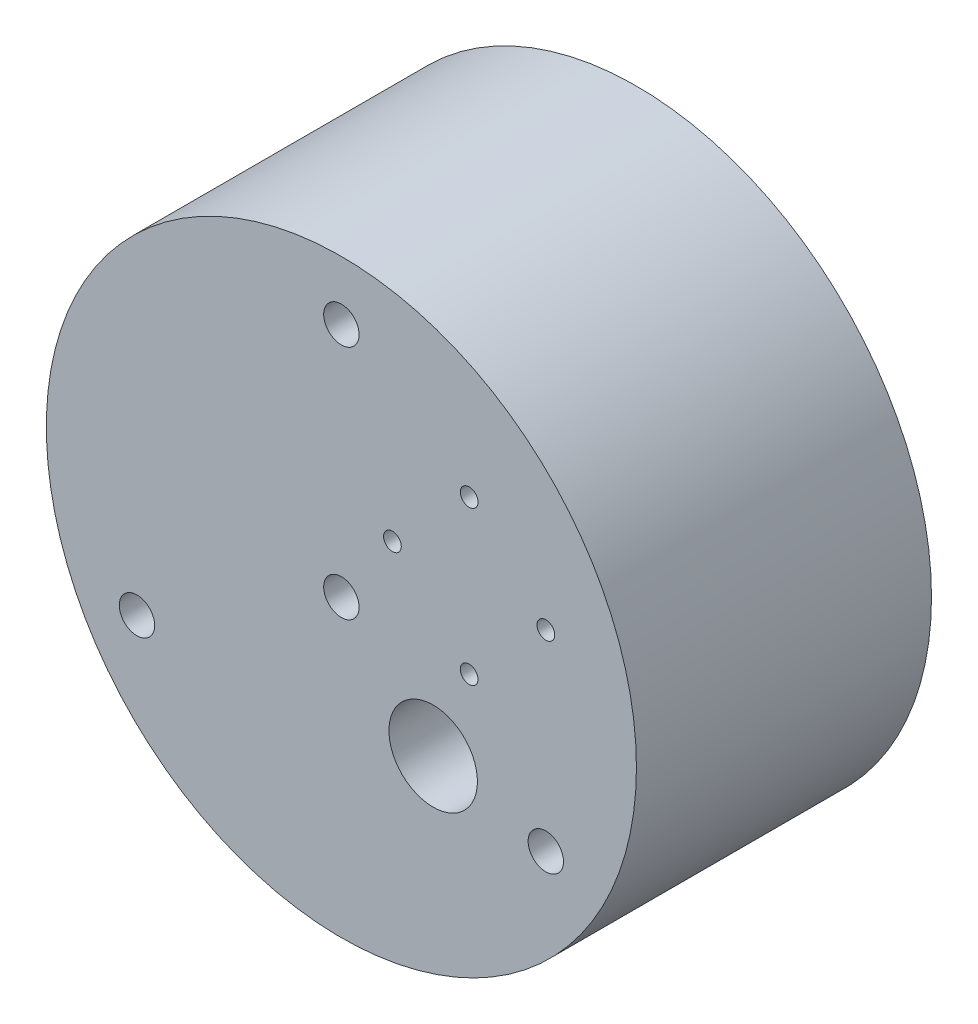
ISO-10303-21;
HEADER;
FILE_DESCRIPTION(('STEP AP214'),'2;1');
FILE_NAME('part.step','',(''),(''),'','','');
FILE_SCHEMA(('AUTOMOTIVE_DESIGN { 1 0 10303 214 1 1 1 1 }'));
ENDSEC;
DATA;
#1=APPLICATION_CONTEXT('core data for automotive mechanical design processes');
#2=APPLICATION_PROTOCOL_DEFINITION('international standard','automotive_design',2000,#1);
#3=PRODUCT_CONTEXT('',#1,'mechanical');
#4=PRODUCT('Part','Part','',(#3));
#5=PRODUCT_RELATED_PRODUCT_CATEGORY('part','',(#4));
#6=PRODUCT_DEFINITION_FORMATION('','',#4);
#7=PRODUCT_DEFINITION_CONTEXT('part definition',#1,'design');
#8=PRODUCT_DEFINITION('design','',#6,#7);
#9=PRODUCT_DEFINITION_SHAPE('','',#8);
#10=(LENGTH_UNIT() NAMED_UNIT(*) SI_UNIT(.MILLI.,.METRE.));
#11=(NAMED_UNIT(*) PLANE_ANGLE_UNIT() SI_UNIT($,.RADIAN.));
#12=(NAMED_UNIT(*) SI_UNIT($,.STERADIAN.) SOLID_ANGLE_UNIT());
#13=UNCERTAINTY_MEASURE_WITH_UNIT(LENGTH_MEASURE(1.E-05),#10,'distance_accuracy_value','');
#14=(GEOMETRIC_REPRESENTATION_CONTEXT(3) GLOBAL_UNCERTAINTY_ASSIGNED_CONTEXT((#13)) GLOBAL_UNIT_ASSIGNED_CONTEXT((#10,
#11,#12)) REPRESENTATION_CONTEXT('',''));
#15=CARTESIAN_POINT('',(0.,0.,0.));
#16=DIRECTION('',(0.,0.,1.));
#17=DIRECTION('',(1.,0.,0.));
#18=AXIS2_PLACEMENT_3D('',#15,#16,#17);
#19=CARTESIAN_POINT('',(0.,0.,50.));
#20=DIRECTION('',(0.,0.,-1.));
#21=DIRECTION('',(-1.,0.,0.));
#22=AXIS2_PLACEMENT_3D('',#19,#20,#21);
#23=CYLINDRICAL_SURFACE('',#22,50.);
#24=CARTESIAN_POINT('',(0.,0.,50.));
#25=DIRECTION('',(0.,0.,1.));
#26=DIRECTION('',(1.,0.,0.));
#27=AXIS2_PLACEMENT_3D('',#24,#25,#26);
#28=CIRCLE('',#27,50.);
#29=CARTESIAN_POINT('',(50.,0.,50.));
#30=VERTEX_POINT('',#29);
#31=EDGE_CURVE('E10',#30,#30,#28,.T.);
#32=ORIENTED_EDGE('',*,*,#31,.F.);
#33=EDGE_LOOP('',(#32));
#34=FACE_BOUND('',#33,.T.);
#35=CARTESIAN_POINT('',(0.,0.,0.));
#36=DIRECTION('',(0.,0.,1.));
#37=DIRECTION('',(1.,0.,0.));
#38=AXIS2_PLACEMENT_3D('',#35,#36,#37);
#39=CIRCLE('',#38,50.);
#40=CARTESIAN_POINT('',(50.,0.,0.));
#41=VERTEX_POINT('',#40);
#42=EDGE_CURVE('E44',#41,#41,#39,.T.);
#43=ORIENTED_EDGE('',*,*,#42,.T.);
#44=EDGE_LOOP('',(#43));
#45=FACE_BOUND('',#44,.T.);
#46=ADVANCED_FACE('F41',(#34,#45),#23,.T.);
#47=CARTESIAN_POINT('',(0.,0.,50.));
#48=DIRECTION('',(0.,0.,1.));
#49=DIRECTION('',(1.,0.,0.));
#50=AXIS2_PLACEMENT_3D('',#47,#48,#49);
#51=PLANE('',#50);
#52=CARTESIAN_POINT('',(15.5563491861041,-15.556349186104,50.));
#53=DIRECTION('',(0.,0.,1.));
#54=DIRECTION('',(1.,0.,0.));
#55=AXIS2_PLACEMENT_3D('',#52,#53,#54);
#56=CIRCLE('',#55,7.5);
#57=CARTESIAN_POINT('',(23.0563491861041,-15.556349186104,50.));
#58=VERTEX_POINT('',#57);
#59=EDGE_CURVE('E119',#58,#58,#56,.T.);
#60=ORIENTED_EDGE('',*,*,#59,.F.);
#61=EDGE_LOOP('',(#60));
#62=FACE_BOUND('',#61,.T.);
#63=CARTESIAN_POINT('',(21.6506350946112,25.4999999999999,50.));
#64=DIRECTION('',(0.,0.,1.));
#65=DIRECTION('',(1.,0.,0.));
#66=AXIS2_PLACEMENT_3D('',#63,#64,#65);
#67=CIRCLE('',#66,1.5);
#68=CARTESIAN_POINT('',(23.1506350946112,25.4999999999999,50.));
#69=VERTEX_POINT('',#68);
#70=EDGE_CURVE('E112',#69,#69,#67,.T.);
#71=ORIENTED_EDGE('',*,*,#70,.F.);
#72=EDGE_LOOP('',(#71));
#73=FACE_BOUND('',#72,.T.);
#74=CARTESIAN_POINT('',(34.6506350946112,12.4999999999999,50.));
#75=DIRECTION('',(0.,0.,1.));
#76=DIRECTION('',(1.,0.,0.));
#77=AXIS2_PLACEMENT_3D('',#74,#75,#76);
#78=CIRCLE('',#77,1.5);
#79=CARTESIAN_POINT('',(36.1506350946112,12.4999999999999,50.));
#80=VERTEX_POINT('',#79);
#81=EDGE_CURVE('E108',#80,#80,#78,.T.);
#82=ORIENTED_EDGE('',*,*,#81,.F.);
#83=EDGE_LOOP('',(#82));
#84=FACE_BOUND('',#83,.T.);
#85=CARTESIAN_POINT('',(21.6506350946112,-0.500000000000111,50.));
#86=DIRECTION('',(0.,0.,1.));
#87=DIRECTION('',(1.,0.,0.));
#88=AXIS2_PLACEMENT_3D('',#85,#86,#87);
#89=CIRCLE('',#88,1.5);
#90=CARTESIAN_POINT('',(23.1506350946112,-0.500000000000111,50.));
#91=VERTEX_POINT('',#90);
#92=EDGE_CURVE('E100',#91,#91,#89,.T.);
#93=ORIENTED_EDGE('',*,*,#92,.F.);
#94=EDGE_LOOP('',(#93));
#95=FACE_BOUND('',#94,.T.);
#96=CARTESIAN_POINT('',(8.65063509461123,12.5,50.));
#97=DIRECTION('',(0.,0.,1.));
#98=DIRECTION('',(1.,0.,0.));
#99=AXIS2_PLACEMENT_3D('',#96,#97,#98);
#100=CIRCLE('',#99,1.5);
#101=CARTESIAN_POINT('',(10.1506350946112,12.5,50.));
#102=VERTEX_POINT('',#101);
#103=EDGE_CURVE('E91',#102,#102,#100,.T.);
#104=ORIENTED_EDGE('',*,*,#103,.F.);
#105=EDGE_LOOP('',(#104));
#106=FACE_BOUND('',#105,.T.);
#107=CARTESIAN_POINT('',(0.,40.,50.));
#108=DIRECTION('',(0.,0.,1.));
#109=DIRECTION('',(1.,0.,0.));
#110=AXIS2_PLACEMENT_3D('',#107,#108,#109);
#111=CIRCLE('',#110,3.);
#112=CARTESIAN_POINT('',(3.,40.,50.));
#113=VERTEX_POINT('',#112);
#114=EDGE_CURVE('E80',#113,#113,#111,.T.);
#115=ORIENTED_EDGE('',*,*,#114,.F.);
#116=EDGE_LOOP('',(#115));
#117=FACE_BOUND('',#116,.T.);
#118=CARTESIAN_POINT('',(0.,0.,50.));
#119=DIRECTION('',(0.,0.,1.));
#120=DIRECTION('',(1.,0.,0.));
#121=AXIS2_PLACEMENT_3D('',#118,#119,#120);
#122=CIRCLE('',#121,3.);
#123=CARTESIAN_POINT('',(3.,0.,50.));
#124=VERTEX_POINT('',#123);
#125=EDGE_CURVE('E76',#124,#124,#122,.T.);
#126=ORIENTED_EDGE('',*,*,#125,.F.);
#127=EDGE_LOOP('',(#126));
#128=FACE_BOUND('',#127,.T.);
#129=CARTESIAN_POINT('',(34.6410161513775,-20.,50.));
#130=DIRECTION('',(0.,0.,1.));
#131=DIRECTION('',(1.,0.,0.));
#132=AXIS2_PLACEMENT_3D('',#129,#130,#131);
#133=CIRCLE('',#132,3.0000000000002);
#134=CARTESIAN_POINT('',(37.6410161513777,-20.,50.));
#135=VERTEX_POINT('',#134);
#136=EDGE_CURVE('E68',#135,#135,#133,.T.);
#137=ORIENTED_EDGE('',*,*,#136,.F.);
#138=EDGE_LOOP('',(#137));
#139=FACE_BOUND('',#138,.T.);
#140=CARTESIAN_POINT('',(-34.6410161513775,-20.,50.));
#141=DIRECTION('',(0.,0.,1.));
#142=DIRECTION('',(1.,0.,0.));
#143=AXIS2_PLACEMENT_3D('',#140,#141,#142);
#144=CIRCLE('',#143,3.);
#145=CARTESIAN_POINT('',(-31.6410161513775,-20.,50.));
#146=VERTEX_POINT('',#145);
#147=EDGE_CURVE('E59',#146,#146,#144,.T.);
#148=ORIENTED_EDGE('',*,*,#147,.F.);
#149=EDGE_LOOP('',(#148));
#150=FACE_BOUND('',#149,.T.);
#151=ORIENTED_EDGE('',*,*,#31,.T.);
#152=EDGE_LOOP('',(#151));
#153=FACE_BOUND('',#152,.T.);
#154=ADVANCED_FACE('F137',(#62,#73,#84,#95,#106,#117,#128,#139,#150,#153),#51,.T.);
#155=CARTESIAN_POINT('',(0.,0.,0.));
#156=DIRECTION('',(0.,0.,1.));
#157=DIRECTION('',(1.,0.,0.));
#158=AXIS2_PLACEMENT_3D('',#155,#156,#157);
#159=PLANE('',#158);
#160=CARTESIAN_POINT('',(15.5563491861041,-15.556349186104,0.));
#161=DIRECTION('',(0.,0.,1.));
#162=DIRECTION('',(1.,0.,0.));
#163=AXIS2_PLACEMENT_3D('',#160,#161,#162);
#164=CIRCLE('',#163,7.5);
#165=CARTESIAN_POINT('',(23.0563491861041,-15.556349186104,0.));
#166=VERTEX_POINT('',#165);
#167=EDGE_CURVE('E92',#166,#166,#164,.T.);
#168=ORIENTED_EDGE('',*,*,#167,.T.);
#169=EDGE_LOOP('',(#168));
#170=FACE_BOUND('',#169,.T.);
#171=CARTESIAN_POINT('',(0.,40.,0.));
#172=DIRECTION('',(0.,0.,1.));
#173=DIRECTION('',(1.,0.,0.));
#174=AXIS2_PLACEMENT_3D('',#171,#172,#173);
#175=CIRCLE('',#174,3.);
#176=CARTESIAN_POINT('',(3.,40.,0.));
#177=VERTEX_POINT('',#176);
#178=EDGE_CURVE('E53',#177,#177,#175,.T.);
#179=ORIENTED_EDGE('',*,*,#178,.T.);
#180=EDGE_LOOP('',(#179));
#181=FACE_BOUND('',#180,.T.);
#182=CARTESIAN_POINT('',(0.,0.,0.));
#183=DIRECTION('',(0.,0.,1.));
#184=DIRECTION('',(1.,0.,0.));
#185=AXIS2_PLACEMENT_3D('',#182,#183,#184);
#186=CIRCLE('',#185,3.);
#187=CARTESIAN_POINT('',(3.,0.,0.));
#188=VERTEX_POINT('',#187);
#189=EDGE_CURVE('E72',#188,#188,#186,.T.);
#190=ORIENTED_EDGE('',*,*,#189,.T.);
#191=EDGE_LOOP('',(#190));
#192=FACE_BOUND('',#191,.T.);
#193=CARTESIAN_POINT('',(34.6410161513775,-20.,0.));
#194=DIRECTION('',(0.,0.,1.));
#195=DIRECTION('',(1.,0.,0.));
#196=AXIS2_PLACEMENT_3D('',#193,#194,#195);
#197=CIRCLE('',#196,3.0000000000002);
#198=CARTESIAN_POINT('',(37.6410161513777,-20.,0.));
#199=VERTEX_POINT('',#198);
#200=EDGE_CURVE('E64',#199,#199,#197,.T.);
#201=ORIENTED_EDGE('',*,*,#200,.T.);
#202=EDGE_LOOP('',(#201));
#203=FACE_BOUND('',#202,.T.);
#204=CARTESIAN_POINT('',(-34.6410161513775,-20.,0.));
#205=DIRECTION('',(0.,0.,1.));
#206=DIRECTION('',(1.,0.,0.));
#207=AXIS2_PLACEMENT_3D('',#204,#205,#206);
#208=CIRCLE('',#207,3.);
#209=CARTESIAN_POINT('',(-31.6410161513775,-20.,0.));
#210=VERTEX_POINT('',#209);
#211=EDGE_CURVE('E55',#210,#210,#208,.T.);
#212=ORIENTED_EDGE('',*,*,#211,.T.);
#213=EDGE_LOOP('',(#212));
#214=FACE_BOUND('',#213,.T.);
#215=ORIENTED_EDGE('',*,*,#42,.F.);
#216=EDGE_LOOP('',(#215));
#217=FACE_BOUND('',#216,.T.);
#218=ADVANCED_FACE('F127',(#170,#181,#192,#203,#214,#217),#159,.F.);
#219=CARTESIAN_POINT('',(-34.6410161513775,-20.,0.));
#220=DIRECTION('',(0.,0.,1.));
#221=DIRECTION('',(1.,0.,0.));
#222=AXIS2_PLACEMENT_3D('',#219,#220,#221);
#223=CYLINDRICAL_SURFACE('',#222,3.);
#224=ORIENTED_EDGE('',*,*,#211,.F.);
#225=EDGE_LOOP('',(#224));
#226=FACE_BOUND('',#225,.T.);
#227=ORIENTED_EDGE('',*,*,#147,.T.);
#228=EDGE_LOOP('',(#227));
#229=FACE_BOUND('',#228,.T.);
#230=ADVANCED_FACE('F157',(#226,#229),#223,.F.);
#231=CARTESIAN_POINT('',(34.6410161513775,-20.,0.));
#232=DIRECTION('',(0.,0.,1.));
#233=DIRECTION('',(1.,0.,0.));
#234=AXIS2_PLACEMENT_3D('',#231,#232,#233);
#235=CYLINDRICAL_SURFACE('',#234,3.0000000000002);
#236=ORIENTED_EDGE('',*,*,#200,.F.);
#237=EDGE_LOOP('',(#236));
#238=FACE_BOUND('',#237,.T.);
#239=ORIENTED_EDGE('',*,*,#136,.T.);
#240=EDGE_LOOP('',(#239));
#241=FACE_BOUND('',#240,.T.);
#242=ADVANCED_FACE('F159',(#238,#241),#235,.F.);
#243=CARTESIAN_POINT('',(0.,0.,0.));
#244=DIRECTION('',(0.,0.,1.));
#245=DIRECTION('',(1.,0.,0.));
#246=AXIS2_PLACEMENT_3D('',#243,#244,#245);
#247=CYLINDRICAL_SURFACE('',#246,3.);
#248=ORIENTED_EDGE('',*,*,#189,.F.);
#249=EDGE_LOOP('',(#248));
#250=FACE_BOUND('',#249,.T.);
#251=ORIENTED_EDGE('',*,*,#125,.T.);
#252=EDGE_LOOP('',(#251));
#253=FACE_BOUND('',#252,.T.);
#254=ADVANCED_FACE('F166',(#250,#253),#247,.F.);
#255=CARTESIAN_POINT('',(0.,40.,0.));
#256=DIRECTION('',(0.,0.,1.));
#257=DIRECTION('',(1.,0.,0.));
#258=AXIS2_PLACEMENT_3D('',#255,#256,#257);
#259=CYLINDRICAL_SURFACE('',#258,3.);
#260=ORIENTED_EDGE('',*,*,#178,.F.);
#261=EDGE_LOOP('',(#260));
#262=FACE_BOUND('',#261,.T.);
#263=ORIENTED_EDGE('',*,*,#114,.T.);
#264=EDGE_LOOP('',(#263));
#265=FACE_BOUND('',#264,.T.);
#266=ADVANCED_FACE('F258',(#262,#265),#259,.F.);
#267=CARTESIAN_POINT('',(8.65063509461123,12.5,40.));
#268=DIRECTION('',(0.,0.,1.));
#269=DIRECTION('',(1.,0.,0.));
#270=AXIS2_PLACEMENT_3D('',#267,#268,#269);
#271=CYLINDRICAL_SURFACE('',#270,1.5);
#272=CARTESIAN_POINT('',(8.65063509461123,12.5,40.));
#273=DIRECTION('',(0.,0.,1.));
#274=DIRECTION('',(1.,0.,0.));
#275=AXIS2_PLACEMENT_3D('',#272,#273,#274);
#276=CIRCLE('',#275,1.5);
#277=CARTESIAN_POINT('',(10.1506350946112,12.5,40.));
#278=VERTEX_POINT('',#277);
#279=EDGE_CURVE('E87',#278,#278,#276,.T.);
#280=ORIENTED_EDGE('',*,*,#279,.F.);
#281=EDGE_LOOP('',(#280));
#282=FACE_BOUND('',#281,.T.);
#283=ORIENTED_EDGE('',*,*,#103,.T.);
#284=EDGE_LOOP('',(#283));
#285=FACE_BOUND('',#284,.T.);
#286=ADVANCED_FACE('F250',(#282,#285),#271,.F.);
#287=CARTESIAN_POINT('',(8.65063509461123,12.5,40.));
#288=DIRECTION('',(0.,0.,1.));
#289=DIRECTION('',(1.,0.,0.));
#290=AXIS2_PLACEMENT_3D('',#287,#288,#289);
#291=PLANE('',#290);
#292=ORIENTED_EDGE('',*,*,#279,.T.);
#293=EDGE_LOOP('',(#292));
#294=FACE_BOUND('',#293,.T.);
#295=ADVANCED_FACE('F242',(#294),#291,.T.);
#296=CARTESIAN_POINT('',(21.6506350946112,-0.500000000000111,40.));
#297=DIRECTION('',(0.,0.,1.));
#298=DIRECTION('',(1.,0.,0.));
#299=AXIS2_PLACEMENT_3D('',#296,#297,#298);
#300=CYLINDRICAL_SURFACE('',#299,1.5);
#301=CARTESIAN_POINT('',(21.6506350946112,-0.500000000000111,40.));
#302=DIRECTION('',(0.,0.,1.));
#303=DIRECTION('',(1.,0.,0.));
#304=AXIS2_PLACEMENT_3D('',#301,#302,#303);
#305=CIRCLE('',#304,1.5);
#306=CARTESIAN_POINT('',(23.1506350946112,-0.500000000000111,40.));
#307=VERTEX_POINT('',#306);
#308=EDGE_CURVE('E96',#307,#307,#305,.T.);
#309=ORIENTED_EDGE('',*,*,#308,.F.);
#310=EDGE_LOOP('',(#309));
#311=FACE_BOUND('',#310,.T.);
#312=ORIENTED_EDGE('',*,*,#92,.T.);
#313=EDGE_LOOP('',(#312));
#314=FACE_BOUND('',#313,.T.);
#315=ADVANCED_FACE('F234',(#311,#314),#300,.F.);
#316=CARTESIAN_POINT('',(21.6506350946112,-0.500000000000111,40.));
#317=DIRECTION('',(0.,0.,1.));
#318=DIRECTION('',(1.,0.,0.));
#319=AXIS2_PLACEMENT_3D('',#316,#317,#318);
#320=PLANE('',#319);
#321=ORIENTED_EDGE('',*,*,#308,.T.);
#322=EDGE_LOOP('',(#321));
#323=FACE_BOUND('',#322,.T.);
#324=ADVANCED_FACE('F226',(#323),#320,.T.);
#325=CARTESIAN_POINT('',(34.6506350946112,12.4999999999999,40.));
#326=DIRECTION('',(0.,0.,1.));
#327=DIRECTION('',(1.,0.,0.));
#328=AXIS2_PLACEMENT_3D('',#325,#326,#327);
#329=CYLINDRICAL_SURFACE('',#328,1.5);
#330=CARTESIAN_POINT('',(34.6506350946112,12.4999999999999,40.));
#331=DIRECTION('',(0.,0.,1.));
#332=DIRECTION('',(1.,0.,0.));
#333=AXIS2_PLACEMENT_3D('',#330,#331,#332);
#334=CIRCLE('',#333,1.5);
#335=CARTESIAN_POINT('',(36.1506350946112,12.4999999999999,40.));
#336=VERTEX_POINT('',#335);
#337=EDGE_CURVE('E104',#336,#336,#334,.T.);
#338=ORIENTED_EDGE('',*,*,#337,.F.);
#339=EDGE_LOOP('',(#338));
#340=FACE_BOUND('',#339,.T.);
#341=ORIENTED_EDGE('',*,*,#81,.T.);
#342=EDGE_LOOP('',(#341));
#343=FACE_BOUND('',#342,.T.);
#344=ADVANCED_FACE('F218',(#340,#343),#329,.F.);
#345=CARTESIAN_POINT('',(34.6506350946112,12.4999999999999,40.));
#346=DIRECTION('',(0.,0.,1.));
#347=DIRECTION('',(1.,0.,0.));
#348=AXIS2_PLACEMENT_3D('',#345,#346,#347);
#349=PLANE('',#348);
#350=ORIENTED_EDGE('',*,*,#337,.T.);
#351=EDGE_LOOP('',(#350));
#352=FACE_BOUND('',#351,.T.);
#353=ADVANCED_FACE('F210',(#352),#349,.T.);
#354=CARTESIAN_POINT('',(21.6506350946112,25.4999999999999,40.));
#355=DIRECTION('',(0.,0.,1.));
#356=DIRECTION('',(1.,0.,0.));
#357=AXIS2_PLACEMENT_3D('',#354,#355,#356);
#358=CYLINDRICAL_SURFACE('',#357,1.5);
#359=CARTESIAN_POINT('',(21.6506350946112,25.4999999999999,40.));
#360=DIRECTION('',(0.,0.,1.));
#361=DIRECTION('',(1.,0.,0.));
#362=AXIS2_PLACEMENT_3D('',#359,#360,#361);
#363=CIRCLE('',#362,1.5);
#364=CARTESIAN_POINT('',(23.1506350946112,25.4999999999999,40.));
#365=VERTEX_POINT('',#364);
#366=EDGE_CURVE('E60',#365,#365,#363,.T.);
#367=ORIENTED_EDGE('',*,*,#366,.F.);
#368=EDGE_LOOP('',(#367));
#369=FACE_BOUND('',#368,.T.);
#370=ORIENTED_EDGE('',*,*,#70,.T.);
#371=EDGE_LOOP('',(#370));
#372=FACE_BOUND('',#371,.T.);
#373=ADVANCED_FACE('F203',(#369,#372),#358,.F.);
#374=CARTESIAN_POINT('',(21.6506350946112,25.4999999999999,40.));
#375=DIRECTION('',(0.,0.,1.));
#376=DIRECTION('',(1.,0.,0.));
#377=AXIS2_PLACEMENT_3D('',#374,#375,#376);
#378=PLANE('',#377);
#379=ORIENTED_EDGE('',*,*,#366,.T.);
#380=EDGE_LOOP('',(#379));
#381=FACE_BOUND('',#380,.T.);
#382=ADVANCED_FACE('F133',(#381),#378,.T.);
#383=CARTESIAN_POINT('',(15.5563491861041,-15.556349186104,0.));
#384=DIRECTION('',(0.,0.,1.));
#385=DIRECTION('',(1.,0.,0.));
#386=AXIS2_PLACEMENT_3D('',#383,#384,#385);
#387=CYLINDRICAL_SURFACE('',#386,7.5);
#388=ORIENTED_EDGE('',*,*,#167,.F.);
#389=EDGE_LOOP('',(#388));
#390=FACE_BOUND('',#389,.T.);
#391=ORIENTED_EDGE('',*,*,#59,.T.);
#392=EDGE_LOOP('',(#391));
#393=FACE_BOUND('',#392,.T.);
#394=ADVANCED_FACE('F130',(#390,#393),#387,.F.);
#395=CLOSED_SHELL('',(#46,#154,#218,#230,#242,#254,#266,#286,#295,#315,#324,#344,#353,#373,#382,#394));
#396=MANIFOLD_SOLID_BREP('B2',#395);
#397=ADVANCED_BREP_SHAPE_REPRESENTATION('',(#18,#396),#14);
#398=SHAPE_DEFINITION_REPRESENTATION(#9,#397);
ENDSEC;
END-ISO-10303-21;
